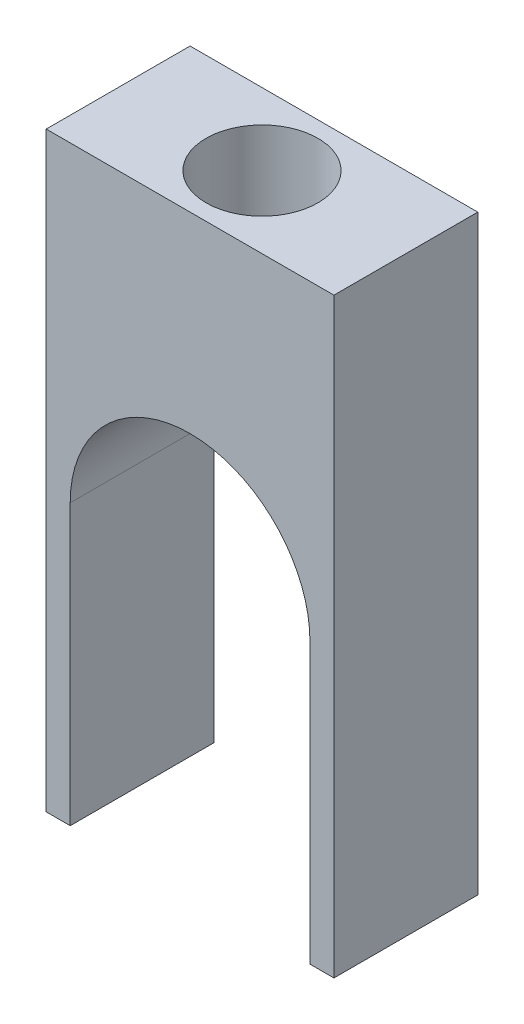
ISO-10303-21;
HEADER;
FILE_DESCRIPTION(('STEP AP214'),'2;1');
FILE_NAME('part.step','',(''),(''),'','','');
FILE_SCHEMA(('AUTOMOTIVE_DESIGN { 1 0 10303 214 1 1 1 1 }'));
ENDSEC;
DATA;
#1=APPLICATION_CONTEXT('core data for automotive mechanical design processes');
#2=APPLICATION_PROTOCOL_DEFINITION('international standard','automotive_design',2000,#1);
#3=PRODUCT_CONTEXT('',#1,'mechanical');
#4=PRODUCT('Part','Part','',(#3));
#5=PRODUCT_RELATED_PRODUCT_CATEGORY('part','',(#4));
#6=PRODUCT_DEFINITION_FORMATION('','',#4);
#7=PRODUCT_DEFINITION_CONTEXT('part definition',#1,'design');
#8=PRODUCT_DEFINITION('design','',#6,#7);
#9=PRODUCT_DEFINITION_SHAPE('','',#8);
#10=(LENGTH_UNIT() NAMED_UNIT(*) SI_UNIT(.MILLI.,.METRE.));
#11=(NAMED_UNIT(*) PLANE_ANGLE_UNIT() SI_UNIT($,.RADIAN.));
#12=(NAMED_UNIT(*) SI_UNIT($,.STERADIAN.) SOLID_ANGLE_UNIT());
#13=UNCERTAINTY_MEASURE_WITH_UNIT(LENGTH_MEASURE(1.E-05),#10,'distance_accuracy_value','');
#14=(GEOMETRIC_REPRESENTATION_CONTEXT(3) GLOBAL_UNCERTAINTY_ASSIGNED_CONTEXT((#13)) GLOBAL_UNIT_ASSIGNED_CONTEXT((#10,
#11,#12)) REPRESENTATION_CONTEXT('',''));
#15=CARTESIAN_POINT('',(0.,0.,0.));
#16=DIRECTION('',(0.,0.,1.));
#17=DIRECTION('',(1.,0.,0.));
#18=AXIS2_PLACEMENT_3D('',#15,#16,#17);
#19=CARTESIAN_POINT('',(0.,0.,18.));
#20=DIRECTION('',(0.,1.,0.));
#21=DIRECTION('',(0.,0.,1.));
#22=AXIS2_PLACEMENT_3D('',#19,#20,#21);
#23=PLANE('',#22);
#24=DIRECTION('',(0.,0.,-1.));
#25=VECTOR('',#24,1.);
#26=CARTESIAN_POINT('',(-33.,0.,18.));
#27=LINE('',#26,#25);
#28=CARTESIAN_POINT('',(-33.,0.,18.));
#29=VERTEX_POINT('',#28);
#30=CARTESIAN_POINT('',(-33.,0.,0.));
#31=VERTEX_POINT('',#30);
#32=EDGE_CURVE('E74',#29,#31,#27,.T.);
#33=ORIENTED_EDGE('',*,*,#32,.F.);
#34=DIRECTION('',(1.,0.,0.));
#35=VECTOR('',#34,1.);
#36=CARTESIAN_POINT('',(0.,0.,18.));
#37=LINE('',#36,#35);
#38=CARTESIAN_POINT('',(-36.,0.,18.));
#39=VERTEX_POINT('',#38);
#40=EDGE_CURVE('E108',#39,#29,#37,.T.);
#41=ORIENTED_EDGE('',*,*,#40,.F.);
#42=DIRECTION('',(0.,0.,-1.));
#43=VECTOR('',#42,1.);
#44=CARTESIAN_POINT('',(-36.,0.,18.));
#45=LINE('',#44,#43);
#46=CARTESIAN_POINT('',(-36.,0.,0.));
#47=VERTEX_POINT('',#46);
#48=EDGE_CURVE('E12',#39,#47,#45,.T.);
#49=ORIENTED_EDGE('',*,*,#48,.T.);
#50=DIRECTION('',(1.,0.,0.));
#51=VECTOR('',#50,1.);
#52=CARTESIAN_POINT('',(0.,0.,0.));
#53=LINE('',#52,#51);
#54=EDGE_CURVE('E170',#47,#31,#53,.T.);
#55=ORIENTED_EDGE('',*,*,#54,.T.);
#56=EDGE_LOOP('',(#33,#41,#49,#55));
#57=FACE_BOUND('',#56,.T.);
#58=ADVANCED_FACE('F59',(#57),#23,.F.);
#59=CARTESIAN_POINT('',(-36.,0.,18.));
#60=DIRECTION('',(1.,0.,0.));
#61=DIRECTION('',(0.,0.,-1.));
#62=AXIS2_PLACEMENT_3D('',#59,#60,#61);
#63=PLANE('',#62);
#64=DIRECTION('',(0.,-1.,0.));
#65=VECTOR('',#64,1.);
#66=CARTESIAN_POINT('',(-36.,0.,0.));
#67=LINE('',#66,#65);
#68=CARTESIAN_POINT('',(-36.,74.,0.));
#69=VERTEX_POINT('',#68);
#70=EDGE_CURVE('E166',#69,#47,#67,.T.);
#71=ORIENTED_EDGE('',*,*,#70,.T.);
#72=ORIENTED_EDGE('',*,*,#48,.F.);
#73=DIRECTION('',(0.,-1.,0.));
#74=VECTOR('',#73,1.);
#75=CARTESIAN_POINT('',(-36.,0.,18.));
#76=LINE('',#75,#74);
#77=CARTESIAN_POINT('',(-36.,74.,18.));
#78=VERTEX_POINT('',#77);
#79=EDGE_CURVE('E157',#78,#39,#76,.T.);
#80=ORIENTED_EDGE('',*,*,#79,.F.);
#81=DIRECTION('',(0.,0.,-1.));
#82=VECTOR('',#81,1.);
#83=CARTESIAN_POINT('',(-36.,74.,18.));
#84=LINE('',#83,#82);
#85=EDGE_CURVE('E83',#78,#69,#84,.T.);
#86=ORIENTED_EDGE('',*,*,#85,.T.);
#87=EDGE_LOOP('',(#71,#72,#80,#86));
#88=FACE_BOUND('',#87,.T.);
#89=ADVANCED_FACE('F61',(#88),#63,.F.);
#90=CARTESIAN_POINT('',(-3.00000000000001,0.,18.));
#91=VERTEX_POINT('',#90);
#92=CARTESIAN_POINT('',(0.,0.,18.));
#93=VERTEX_POINT('',#92);
#94=EDGE_CURVE('E148',#91,#93,#37,.T.);
#95=ORIENTED_EDGE('',*,*,#94,.F.);
#96=DIRECTION('',(0.,0.,-1.));
#97=VECTOR('',#96,1.);
#98=CARTESIAN_POINT('',(-3.00000000000001,0.,18.));
#99=LINE('',#98,#97);
#100=CARTESIAN_POINT('',(-3.00000000000001,0.,0.));
#101=VERTEX_POINT('',#100);
#102=EDGE_CURVE('E133',#91,#101,#99,.T.);
#103=ORIENTED_EDGE('',*,*,#102,.T.);
#104=CARTESIAN_POINT('',(0.,0.,0.));
#105=VERTEX_POINT('',#104);
#106=EDGE_CURVE('E168',#101,#105,#53,.T.);
#107=ORIENTED_EDGE('',*,*,#106,.T.);
#108=DIRECTION('',(0.,0.,-1.));
#109=VECTOR('',#108,1.);
#110=CARTESIAN_POINT('',(0.,0.,18.));
#111=LINE('',#110,#109);
#112=EDGE_CURVE('E67',#93,#105,#111,.T.);
#113=ORIENTED_EDGE('',*,*,#112,.F.);
#114=EDGE_LOOP('',(#95,#103,#107,#113));
#115=FACE_BOUND('',#114,.T.);
#116=ADVANCED_FACE('F154',(#115),#23,.F.);
#117=CARTESIAN_POINT('',(0.,0.,18.));
#118=DIRECTION('',(1.,0.,0.));
#119=DIRECTION('',(0.,0.,-1.));
#120=AXIS2_PLACEMENT_3D('',#117,#118,#119);
#121=PLANE('',#120);
#122=DIRECTION('',(0.,-1.,0.));
#123=VECTOR('',#122,1.);
#124=CARTESIAN_POINT('',(0.,0.,0.));
#125=LINE('',#124,#123);
#126=CARTESIAN_POINT('',(0.,74.,0.));
#127=VERTEX_POINT('',#126);
#128=EDGE_CURVE('E173',#127,#105,#125,.T.);
#129=ORIENTED_EDGE('',*,*,#128,.F.);
#130=DIRECTION('',(0.,0.,-1.));
#131=VECTOR('',#130,1.);
#132=CARTESIAN_POINT('',(0.,74.,18.));
#133=LINE('',#132,#131);
#134=CARTESIAN_POINT('',(0.,74.,18.));
#135=VERTEX_POINT('',#134);
#136=EDGE_CURVE('E179',#135,#127,#133,.T.);
#137=ORIENTED_EDGE('',*,*,#136,.F.);
#138=DIRECTION('',(0.,-1.,0.));
#139=VECTOR('',#138,1.);
#140=CARTESIAN_POINT('',(0.,0.,18.));
#141=LINE('',#140,#139);
#142=EDGE_CURVE('E159',#135,#93,#141,.T.);
#143=ORIENTED_EDGE('',*,*,#142,.T.);
#144=ORIENTED_EDGE('',*,*,#112,.T.);
#145=EDGE_LOOP('',(#129,#137,#143,#144));
#146=FACE_BOUND('',#145,.T.);
#147=ADVANCED_FACE('F182',(#146),#121,.T.);
#148=CARTESIAN_POINT('',(0.,74.,18.));
#149=DIRECTION('',(0.,1.,0.));
#150=DIRECTION('',(0.,0.,1.));
#151=AXIS2_PLACEMENT_3D('',#148,#149,#150);
#152=PLANE('',#151);
#153=CARTESIAN_POINT('',(-18.,74.,9.));
#154=DIRECTION('',(0.,1.,0.));
#155=DIRECTION('',(0.,0.,1.));
#156=AXIS2_PLACEMENT_3D('',#153,#154,#155);
#157=CIRCLE('',#156,7.);
#158=CARTESIAN_POINT('',(-18.,74.,16.));
#159=VERTEX_POINT('',#158);
#160=EDGE_CURVE('E213',#159,#159,#157,.T.);
#161=ORIENTED_EDGE('',*,*,#160,.F.);
#162=EDGE_LOOP('',(#161));
#163=FACE_BOUND('',#162,.T.);
#164=DIRECTION('',(1.,0.,0.));
#165=VECTOR('',#164,1.);
#166=CARTESIAN_POINT('',(0.,74.,0.));
#167=LINE('',#166,#165);
#168=EDGE_CURVE('E160',#69,#127,#167,.T.);
#169=ORIENTED_EDGE('',*,*,#168,.F.);
#170=ORIENTED_EDGE('',*,*,#85,.F.);
#171=DIRECTION('',(1.,0.,0.));
#172=VECTOR('',#171,1.);
#173=CARTESIAN_POINT('',(0.,74.,18.));
#174=LINE('',#173,#172);
#175=EDGE_CURVE('E164',#78,#135,#174,.T.);
#176=ORIENTED_EDGE('',*,*,#175,.T.);
#177=ORIENTED_EDGE('',*,*,#136,.T.);
#178=EDGE_LOOP('',(#169,#170,#176,#177));
#179=FACE_BOUND('',#178,.T.);
#180=ADVANCED_FACE('F185',(#163,#179),#152,.T.);
#181=CARTESIAN_POINT('',(0.,0.,18.));
#182=DIRECTION('',(0.,0.,1.));
#183=DIRECTION('',(1.,0.,0.));
#184=AXIS2_PLACEMENT_3D('',#181,#182,#183);
#185=PLANE('',#184);
#186=DIRECTION('',(0.,-1.,0.));
#187=VECTOR('',#186,1.);
#188=CARTESIAN_POINT('',(-3.00000000000001,35.,18.));
#189=LINE('',#188,#187);
#190=CARTESIAN_POINT('',(-3.00000000000001,35.,18.));
#191=VERTEX_POINT('',#190);
#192=EDGE_CURVE('E136',#191,#91,#189,.T.);
#193=ORIENTED_EDGE('',*,*,#192,.T.);
#194=ORIENTED_EDGE('',*,*,#94,.T.);
#195=ORIENTED_EDGE('',*,*,#142,.F.);
#196=ORIENTED_EDGE('',*,*,#175,.F.);
#197=ORIENTED_EDGE('',*,*,#79,.T.);
#198=ORIENTED_EDGE('',*,*,#40,.T.);
#199=DIRECTION('',(0.,-1.,0.));
#200=VECTOR('',#199,1.);
#201=CARTESIAN_POINT('',(-33.,35.,18.));
#202=LINE('',#201,#200);
#203=CARTESIAN_POINT('',(-33.,35.,18.));
#204=VERTEX_POINT('',#203);
#205=EDGE_CURVE('E151',#204,#29,#202,.T.);
#206=ORIENTED_EDGE('',*,*,#205,.F.);
#207=CARTESIAN_POINT('',(-18.,35.,18.));
#208=DIRECTION('',(0.,0.,1.));
#209=DIRECTION('',(1.,0.,0.));
#210=AXIS2_PLACEMENT_3D('',#207,#208,#209);
#211=CIRCLE('',#210,15.);
#212=EDGE_CURVE('E143',#191,#204,#211,.T.);
#213=ORIENTED_EDGE('',*,*,#212,.F.);
#214=EDGE_LOOP('',(#193,#194,#195,#196,#197,#198,#206,#213));
#215=FACE_BOUND('',#214,.T.);
#216=ADVANCED_FACE('F146',(#215),#185,.T.);
#217=CARTESIAN_POINT('',(0.,0.,0.));
#218=DIRECTION('',(0.,0.,1.));
#219=DIRECTION('',(1.,0.,0.));
#220=AXIS2_PLACEMENT_3D('',#217,#218,#219);
#221=PLANE('',#220);
#222=ORIENTED_EDGE('',*,*,#106,.F.);
#223=DIRECTION('',(0.,-1.,0.));
#224=VECTOR('',#223,1.);
#225=CARTESIAN_POINT('',(-3.00000000000001,35.,0.));
#226=LINE('',#225,#224);
#227=CARTESIAN_POINT('',(-3.00000000000001,35.,0.));
#228=VERTEX_POINT('',#227);
#229=EDGE_CURVE('E139',#228,#101,#226,.T.);
#230=ORIENTED_EDGE('',*,*,#229,.F.);
#231=CARTESIAN_POINT('',(-18.,35.,0.));
#232=DIRECTION('',(0.,0.,1.));
#233=DIRECTION('',(1.,0.,0.));
#234=AXIS2_PLACEMENT_3D('',#231,#232,#233);
#235=CIRCLE('',#234,15.);
#236=CARTESIAN_POINT('',(-33.,35.,0.));
#237=VERTEX_POINT('',#236);
#238=EDGE_CURVE('E152',#228,#237,#235,.T.);
#239=ORIENTED_EDGE('',*,*,#238,.T.);
#240=DIRECTION('',(0.,-1.,0.));
#241=VECTOR('',#240,1.);
#242=CARTESIAN_POINT('',(-33.,35.,0.));
#243=LINE('',#242,#241);
#244=EDGE_CURVE('E189',#237,#31,#243,.T.);
#245=ORIENTED_EDGE('',*,*,#244,.T.);
#246=ORIENTED_EDGE('',*,*,#54,.F.);
#247=ORIENTED_EDGE('',*,*,#70,.F.);
#248=ORIENTED_EDGE('',*,*,#168,.T.);
#249=ORIENTED_EDGE('',*,*,#128,.T.);
#250=EDGE_LOOP('',(#222,#230,#239,#245,#246,#247,#248,#249));
#251=FACE_BOUND('',#250,.T.);
#252=ADVANCED_FACE('F184',(#251),#221,.F.);
#253=CARTESIAN_POINT('',(-3.00000000000001,35.,18.));
#254=DIRECTION('',(1.,0.,0.));
#255=DIRECTION('',(0.,0.,-1.));
#256=AXIS2_PLACEMENT_3D('',#253,#254,#255);
#257=PLANE('',#256);
#258=ORIENTED_EDGE('',*,*,#229,.T.);
#259=ORIENTED_EDGE('',*,*,#102,.F.);
#260=ORIENTED_EDGE('',*,*,#192,.F.);
#261=DIRECTION('',(0.,0.,-1.));
#262=VECTOR('',#261,1.);
#263=CARTESIAN_POINT('',(-3.00000000000001,35.,18.));
#264=LINE('',#263,#262);
#265=EDGE_CURVE('E169',#191,#228,#264,.T.);
#266=ORIENTED_EDGE('',*,*,#265,.T.);
#267=EDGE_LOOP('',(#258,#259,#260,#266));
#268=FACE_BOUND('',#267,.T.);
#269=ADVANCED_FACE('F135',(#268),#257,.F.);
#270=CARTESIAN_POINT('',(-18.,35.,18.));
#271=DIRECTION('',(0.,0.,-1.));
#272=DIRECTION('',(-1.,0.,0.));
#273=AXIS2_PLACEMENT_3D('',#270,#271,#272);
#274=CYLINDRICAL_SURFACE('',#273,15.);
#275=CARTESIAN_POINT('',(-18.,50.,16.));
#276=CARTESIAN_POINT('',(-17.8144724903543,49.9999989062768,15.9999987311845));
#277=CARTESIAN_POINT('',(-17.6289108404347,49.9965492462378,15.9926149496319));
#278=CARTESIAN_POINT('',(-17.259135311178,49.9828363155982,15.963156568287));
#279=CARTESIAN_POINT('',(-17.0749221814709,49.9725695089819,15.9410743444807));
#280=CARTESIAN_POINT('',(-16.7089841349934,49.9454673410377,15.8824175764527));
#281=CARTESIAN_POINT('',(-16.5272640099452,49.928620781231,15.8458183231612));
#282=CARTESIAN_POINT('',(-16.1678623326587,49.8887870557922,15.7585122416939));
#283=CARTESIAN_POINT('',(-15.9901824650756,49.8657973778409,15.7077996413029));
#284=CARTESIAN_POINT('',(-15.6408411168908,49.8143651145563,15.5930291161196));
#285=CARTESIAN_POINT('',(-15.4691577014083,49.7859455779182,15.5290275043861));
#286=CARTESIAN_POINT('',(-15.1320074611391,49.7242659158824,15.3881154617424));
#287=CARTESIAN_POINT('',(-14.9665430296055,49.6910039504898,15.3112001222469));
#288=CARTESIAN_POINT('',(-14.6428928731725,49.6204390462863,15.1451512914262));
#289=CARTESIAN_POINT('',(-14.4847027443468,49.5831385995459,15.0560253261356));
#290=CARTESIAN_POINT('',(-14.1762576307084,49.5053212671914,14.8661597675412));
#291=CARTESIAN_POINT('',(-14.0260055707253,49.4648032096043,14.7654159364829));
#292=CARTESIAN_POINT('',(-13.5723982906027,49.3352174768163,14.4351670235891));
#293=CARTESIAN_POINT('',(-13.2837624770057,49.2420761526874,14.1866208200334));
#294=CARTESIAN_POINT('',(-12.7505628682364,49.0543075209071,13.6462489954088));
#295=CARTESIAN_POINT('',(-12.5060280884725,48.9596792791476,13.3543951093714));
#296=CARTESIAN_POINT('',(-12.1692458894956,48.8209401738483,12.8785879777553));
#297=CARTESIAN_POINT('',(-12.0591933743071,48.7738664925622,12.7078579282309));
#298=CARTESIAN_POINT('',(-11.8539814848708,48.6835306533337,12.3567480796531));
#299=CARTESIAN_POINT('',(-11.7588159187729,48.640266914032,12.1763723345952));
#300=CARTESIAN_POINT('',(-11.5842320056339,48.5590265354511,11.8070684944977));
#301=CARTESIAN_POINT('',(-11.5048095728275,48.5210485251475,11.6181426341175));
#302=CARTESIAN_POINT('',(-11.3625294491343,48.451775124541,11.2329619451478));
#303=CARTESIAN_POINT('',(-11.2996701711392,48.4204790940145,11.0367078208234));
#304=CARTESIAN_POINT('',(-11.1943291741414,48.3673531698136,10.6494932833254));
#305=CARTESIAN_POINT('',(-11.1509064716103,48.3450926725968,10.4588480946643));
#306=CARTESIAN_POINT('',(-11.0800897669681,48.308509999873,10.0738452185197));
#307=CARTESIAN_POINT('',(-11.0526951604446,48.2941875250276,9.87948767131311));
#308=CARTESIAN_POINT('',(-11.0143346001328,48.2740706095154,9.4888472013927));
#309=CARTESIAN_POINT('',(-11.0033576736239,48.268270473008,9.29256565297039));
#310=CARTESIAN_POINT('',(-10.9979628601536,48.2654245810255,8.89971851980438));
#311=CARTESIAN_POINT('',(-11.0035437268629,48.2683781666449,8.70315295755201));
#312=CARTESIAN_POINT('',(-11.0297749517005,48.2821739666281,8.33133975246732));
#313=CARTESIAN_POINT('',(-11.048844001363,48.2921880639042,8.15594684775974));
#314=CARTESIAN_POINT('',(-11.1000696671764,48.3188511388526,7.80753469158967));
#315=CARTESIAN_POINT('',(-11.132230683858,48.3355023473812,7.63451625847838));
#316=CARTESIAN_POINT('',(-11.2092830358291,48.3749029758743,7.29208944033967));
#317=CARTESIAN_POINT('',(-11.2541720309192,48.3976512747697,7.12268039783069));
#318=CARTESIAN_POINT('',(-11.3562560844524,48.4485656794008,6.78838761974696));
#319=CARTESIAN_POINT('',(-11.4134559396177,48.476733896463,6.62350567639755));
#320=CARTESIAN_POINT('',(-11.5410925981186,48.5383766583609,6.29552875500583));
#321=CARTESIAN_POINT('',(-11.6117997215619,48.5719568830626,6.13255870779857));
#322=CARTESIAN_POINT('',(-11.7649931003743,48.6430140070596,5.81313368756305));
#323=CARTESIAN_POINT('',(-11.847483297425,48.6804922091636,5.65668091741101));
#324=CARTESIAN_POINT('',(-12.111883257174,48.7973596666347,5.19810690542785));
#325=CARTESIAN_POINT('',(-12.3107856941847,48.8812136856748,4.90660842705447));
#326=CARTESIAN_POINT('',(-12.6513180373986,49.0145878791314,4.48008319514176));
#327=CARTESIAN_POINT('',(-12.7790245294469,49.062774006816,4.33316946029705));
#328=CARTESIAN_POINT('',(-13.0462296024235,49.1591066274215,4.0504618618073));
#329=CARTESIAN_POINT('',(-13.1857250243727,49.2072531274913,3.91466503833858));
#330=CARTESIAN_POINT('',(-13.4758823934247,49.3022965716615,3.65487840277979));
#331=CARTESIAN_POINT('',(-13.626552407589,49.3491925791524,3.53089727104321));
#332=CARTESIAN_POINT('',(-13.9381453655387,49.4404874529307,3.29566653621278));
#333=CARTESIAN_POINT('',(-14.0990642011653,49.4848873065116,3.18441188119369));
#334=CARTESIAN_POINT('',(-14.4363555064618,49.5716107423194,2.97159845626735));
#335=CARTESIAN_POINT('',(-14.6130765428049,49.6138009529048,2.87053656145541));
#336=CARTESIAN_POINT('',(-14.9754904734718,49.6930843662266,2.68384062940458));
#337=CARTESIAN_POINT('',(-15.1611793460062,49.7301798256273,2.59819975632945));
#338=CARTESIAN_POINT('',(-15.5402645986457,49.7982015015905,2.44320063761778));
#339=CARTESIAN_POINT('',(-15.7336584964581,49.8291296860587,2.37383719678827));
#340=CARTESIAN_POINT('',(-16.1267169396255,49.8838894885933,2.25217654360744));
#341=CARTESIAN_POINT('',(-16.3263808661658,49.9077218045617,2.19987765285264));
#342=CARTESIAN_POINT('',(-16.7150935708123,49.9460444220633,2.11628636906312));
#343=CARTESIAN_POINT('',(-16.9038108855109,49.9611026527104,2.08370962358555));
#344=CARTESIAN_POINT('',(-17.2837084004173,49.9840958549318,2.03411066061369));
#345=CARTESIAN_POINT('',(-17.4748884776144,49.9920311808939,2.01708766926839));
#346=CARTESIAN_POINT('',(-17.8581006358246,50.0005528438796,1.99881076929322));
#347=CARTESIAN_POINT('',(-18.0501324143964,50.0011416086632,1.9975516513001));
#348=CARTESIAN_POINT('',(-18.4335280422512,49.9949593473442,2.01080539431755));
#349=CARTESIAN_POINT('',(-18.6248919139736,49.9881885709307,2.02531772024613));
#350=CARTESIAN_POINT('',(-18.9928708344438,49.9681629903725,2.06846060257583));
#351=CARTESIAN_POINT('',(-19.169628166118,49.9553639048463,2.09609987965404));
#352=CARTESIAN_POINT('',(-19.5200595094423,49.9238191531151,2.16470144607146));
#353=CARTESIAN_POINT('',(-19.6937324410644,49.9050714456742,2.20566830881837));
#354=CARTESIAN_POINT('',(-20.0367577183847,49.8620823178559,2.30050187252136));
#355=CARTESIAN_POINT('',(-20.2061113773966,49.8378425900775,2.35436459935943));
#356=CARTESIAN_POINT('',(-20.5396072433998,49.7844151696283,2.47452478760405));
#357=CARTESIAN_POINT('',(-20.7037474303026,49.7552255861255,2.54082700189594));
#358=CARTESIAN_POINT('',(-21.030736760353,49.6916030220054,2.68749655585051));
#359=CARTESIAN_POINT('',(-21.193396832886,49.6570381953359,2.7682285317781));
#360=CARTESIAN_POINT('',(-21.5113451762473,49.584138843629,2.94167648843356));
#361=CARTESIAN_POINT('',(-21.6666307162628,49.5458029380419,3.03439686191408));
#362=CARTESIAN_POINT('',(-22.1202318250542,49.4264075499976,3.32957304653616));
#363=CARTESIAN_POINT('',(-22.4064664376566,49.3409250342679,3.54912277200806));
#364=CARTESIAN_POINT('',(-22.9647193083283,49.1578733053259,4.04982570939146));
#365=CARTESIAN_POINT('',(-23.2332819685322,49.0599018903553,4.33469554291427));
#366=CARTESIAN_POINT('',(-23.5982197421826,48.9167925594408,4.79307552483794));
#367=CARTESIAN_POINT('',(-23.7136215184732,48.8696962817171,4.95118059841928));
#368=CARTESIAN_POINT('',(-23.9310734205115,48.7781079674164,5.27700624060715));
#369=CARTESIAN_POINT('',(-24.033128713024,48.733614926768,5.44472305188471));
#370=CARTESIAN_POINT('',(-24.2262888073018,48.6471574298561,5.79460207257833));
#371=CARTESIAN_POINT('',(-24.316920401343,48.605325087148,5.97705847048482));
#372=CARTESIAN_POINT('',(-24.4822648610648,48.5273278724206,6.35012418382778));
#373=CARTESIAN_POINT('',(-24.5569852987634,48.4911603067471,6.54072956912096));
#374=CARTESIAN_POINT('',(-24.6896795774641,48.4258579093784,6.9287219343606));
#375=CARTESIAN_POINT('',(-24.7476645817498,48.3967183918025,7.12610429496493));
#376=CARTESIAN_POINT('',(-24.8461896222493,48.3466383139003,7.5261908368335));
#377=CARTESIAN_POINT('',(-24.8867319156738,48.3256966927398,7.72889432590171));
#378=CARTESIAN_POINT('',(-24.9469356843971,48.2944019582038,8.11936519030305));
#379=CARTESIAN_POINT('',(-24.9681502718332,48.2832643862308,8.30683137066227));
#380=CARTESIAN_POINT('',(-24.9953698324469,48.2689503293364,8.68316551134626));
#381=CARTESIAN_POINT('',(-25.0013757627906,48.2657733434107,8.87203338270439));
#382=CARTESIAN_POINT('',(-24.9980962778897,48.2675035477491,9.2495502626916));
#383=CARTESIAN_POINT('',(-24.9888145749873,48.2724087753849,9.43819931332611));
#384=CARTESIAN_POINT('',(-24.9550945698945,48.290109888523,9.8137582576));
#385=CARTESIAN_POINT('',(-24.9306566294976,48.3029055856724,10.0006681926456));
#386=CARTESIAN_POINT('',(-24.8692843881236,48.3346925888752,10.3576820992102));
#387=CARTESIAN_POINT('',(-24.8333964414475,48.3531614744204,10.5280143144271));
#388=CARTESIAN_POINT('',(-24.7492425920505,48.3958930302163,10.8649072716243));
#389=CARTESIAN_POINT('',(-24.7009725005989,48.4201576609062,11.0314667165299));
#390=CARTESIAN_POINT('',(-24.5925196098735,48.4737648408456,11.3597822526532));
#391=CARTESIAN_POINT('',(-24.5323385835551,48.5031066342723,11.5215390546333));
#392=CARTESIAN_POINT('',(-24.4005287573588,48.566081427855,11.839518895929));
#393=CARTESIAN_POINT('',(-24.3288955453449,48.5997160808917,11.9957397739882));
#394=CARTESIAN_POINT('',(-24.1696221549088,48.6727441336945,12.3119684241976));
#395=CARTESIAN_POINT('',(-24.0812384009807,48.7123709267442,12.4715478116527));
#396=CARTESIAN_POINT('',(-23.8926377344072,48.7944698641418,12.7828501854864));
#397=CARTESIAN_POINT('',(-23.7924167721296,48.8369429800842,12.9345704574946));
#398=CARTESIAN_POINT('',(-23.5807317216298,48.9236674839918,13.2294661262661));
#399=CARTESIAN_POINT('',(-23.4692651189406,48.9679192683215,13.3726396005683));
#400=CARTESIAN_POINT('',(-23.2356806677691,49.0571433668396,13.6497844475505));
#401=CARTESIAN_POINT('',(-23.1135621530116,49.1021157259559,13.7837552436662));
#402=CARTESIAN_POINT('',(-22.8464368057593,49.1962694508257,14.0548804671891));
#403=CARTESIAN_POINT('',(-22.7003634060584,49.2454187789171,14.1909977280873));
#404=CARTESIAN_POINT('',(-22.3968457119163,49.3420047892902,14.4504676910772));
#405=CARTESIAN_POINT('',(-22.2394049941334,49.3894420032928,14.5738243787442));
#406=CARTESIAN_POINT('',(-21.9138063118185,49.4813935477573,14.8070870710599));
#407=CARTESIAN_POINT('',(-21.745638492954,49.525905112131,14.916980429089));
#408=CARTESIAN_POINT('',(-21.3997600365314,49.6107261253301,15.1222587440049));
#409=CARTESIAN_POINT('',(-21.2220538576611,49.6510375120433,15.2176504011302));
#410=CARTESIAN_POINT('',(-20.8590097550195,49.7261758713317,15.3926892571868));
#411=CARTESIAN_POINT('',(-20.6737123544563,49.7610281291556,15.4724095083193));
#412=CARTESIAN_POINT('',(-20.2960619407038,49.8244639822681,15.615804406194));
#413=CARTESIAN_POINT('',(-20.1037124103785,49.853050624571,15.6794868544916));
#414=CARTESIAN_POINT('',(-19.7138088580431,49.9030669239484,15.7899797857096));
#415=CARTESIAN_POINT('',(-19.516268041036,49.9245131410752,15.8368293277295));
#416=CARTESIAN_POINT('',(-19.11729196079,49.9596693268297,15.9132383726008));
#417=CARTESIAN_POINT('',(-18.9158593682278,49.9733844185492,15.9428093257229));
#418=CARTESIAN_POINT('',(-18.5949750714916,49.9886652615981,15.9756855034334));
#419=CARTESIAN_POINT('',(-18.476212067356,49.9929110778711,15.9847985310425));
#420=CARTESIAN_POINT('',(-18.2383040749649,49.9985788264754,15.9969562473226));
#421=CARTESIAN_POINT('',(-18.119159079136,50.0000007024675,16.0000008149243));
#422=CARTESIAN_POINT('',(-18.,50.,16.));
#423=B_SPLINE_CURVE_WITH_KNOTS('',3,(#275,#276,#277,#278,#279,#280,#281,#282,#283,#284,#285,
#286,#287,#288,#289,#290,#291,#292,#293,#294,#295,#296,#297,#298,#299,#300,#301,#302,#303,#304,
#305,#306,#307,#308,#309,#310,#311,#312,#313,#314,#315,#316,#317,#318,#319,#320,#321,#322,#323,
#324,#325,#326,#327,#328,#329,#330,#331,#332,#333,#334,#335,#336,#337,#338,#339,#340,#341,#342,
#343,#344,#345,#346,#347,#348,#349,#350,#351,#352,#353,#354,#355,#356,#357,#358,#359,#360,#361,
#362,#363,#364,#365,#366,#367,#368,#369,#370,#371,#372,#373,#374,#375,#376,#377,#378,#379,#380,
#381,#382,#383,#384,#385,#386,#387,#388,#389,#390,#391,#392,#393,#394,#395,#396,#397,#398,#399,
#400,#401,#402,#403,#404,#405,#406,#407,#408,#409,#410,#411,#412,#413,#414,#415,#416,#417,#418,
#419,#420,#421,#422),.UNSPECIFIED.,.T.,.F.,(4,2,2,2,2,2,2,2,2,2,2,2,2,2,2,2,2,2,2,2,2,2,2,2,2,2,
2,2,2,2,2,2,2,2,2,2,2,2,2,2,2,2,2,2,2,2,2,2,2,2,2,2,2,2,2,2,2,2,2,2,2,2,2,2,2,2,2,2,2,2,2,2,2,
4),(0.,0.556463897382044,1.11321665517297,1.67092114244938,2.22885406123899,2.78446926592942,
3.34029614341329,3.89578196472597,4.45147105081952,5.62255040167629,6.7943974524586,
7.41925763509557,8.04385722793118,8.66829450757838,9.29267193086311,9.88222605810051,
10.4717579520758,11.0608956573529,11.6499890184992,12.1794981405363,12.7091853907006,
13.2387753142617,13.7685719585179,14.3103609351528,14.8523315777009,15.9357488970924,
16.5368462109868,17.1377829615941,17.7391578388527,18.3402931586925,18.9631926758349,
19.5858153904363,20.2082391143216,20.8306016005377,21.4061427166912,21.9816551962004,
22.556977485605,23.132280256506,23.6697472508524,24.2073988737646,24.7448850213768,
25.2825769517231,25.8365253406996,26.390677284073,27.4984032609551,28.7034024399018,
29.3068236619325,29.9100105882889,30.5331266643462,31.1559455374183,31.7783479971204,
32.4006698892832,32.9668805427281,33.5330555604721,34.0990931124935,34.6651171531917,
35.1896844187631,35.7144293736939,36.2390962784422,36.763965808717,37.3234087254229,
37.8830435907859,38.4428038661049,39.0025991794738,39.6187477336263,40.2347032581721,
40.8512330078131,41.4674770300147,42.0807765176619,42.6937770882811,43.3053459226826,
43.9165090182831,44.2739029318526,44.6313039755636),.UNSPECIFIED.);
#424=CARTESIAN_POINT('',(-18.,50.,16.));
#425=VERTEX_POINT('',#424);
#426=EDGE_CURVE('E194',#425,#425,#423,.T.);
#427=ORIENTED_EDGE('',*,*,#426,.T.);
#428=EDGE_LOOP('',(#427));
#429=FACE_BOUND('',#428,.T.);
#430=ORIENTED_EDGE('',*,*,#238,.F.);
#431=ORIENTED_EDGE('',*,*,#265,.F.);
#432=ORIENTED_EDGE('',*,*,#212,.T.);
#433=DIRECTION('',(0.,0.,-1.));
#434=VECTOR('',#433,1.);
#435=CARTESIAN_POINT('',(-33.,35.,18.));
#436=LINE('',#435,#434);
#437=EDGE_CURVE('E199',#204,#237,#436,.T.);
#438=ORIENTED_EDGE('',*,*,#437,.T.);
#439=EDGE_LOOP('',(#430,#431,#432,#438));
#440=FACE_BOUND('',#439,.T.);
#441=ADVANCED_FACE('F202',(#429,#440),#274,.F.);
#442=CARTESIAN_POINT('',(-33.,35.,18.));
#443=DIRECTION('',(1.,0.,0.));
#444=DIRECTION('',(0.,0.,-1.));
#445=AXIS2_PLACEMENT_3D('',#442,#443,#444);
#446=PLANE('',#445);
#447=ORIENTED_EDGE('',*,*,#244,.F.);
#448=ORIENTED_EDGE('',*,*,#437,.F.);
#449=ORIENTED_EDGE('',*,*,#205,.T.);
#450=ORIENTED_EDGE('',*,*,#32,.T.);
#451=EDGE_LOOP('',(#447,#448,#449,#450));
#452=FACE_BOUND('',#451,.T.);
#453=ADVANCED_FACE('F203',(#452),#446,.T.);
#454=CARTESIAN_POINT('',(-18.,-0.001000000000001,9.));
#455=DIRECTION('',(0.,1.,0.));
#456=DIRECTION('',(0.,0.,1.));
#457=AXIS2_PLACEMENT_3D('',#454,#455,#456);
#458=CYLINDRICAL_SURFACE('',#457,7.);
#459=ORIENTED_EDGE('',*,*,#160,.T.);
#460=EDGE_LOOP('',(#459));
#461=FACE_BOUND('',#460,.T.);
#462=ORIENTED_EDGE('',*,*,#426,.F.);
#463=EDGE_LOOP('',(#462));
#464=FACE_BOUND('',#463,.T.);
#465=ADVANCED_FACE('F214',(#461,#464),#458,.F.);
#466=CLOSED_SHELL('',(#58,#89,#116,#147,#180,#216,#252,#269,#441,#453,#465));
#467=MANIFOLD_SOLID_BREP('B2',#466);
#468=ADVANCED_BREP_SHAPE_REPRESENTATION('',(#18,#467),#14);
#469=SHAPE_DEFINITION_REPRESENTATION(#9,#468);
ENDSEC;
END-ISO-10303-21;
